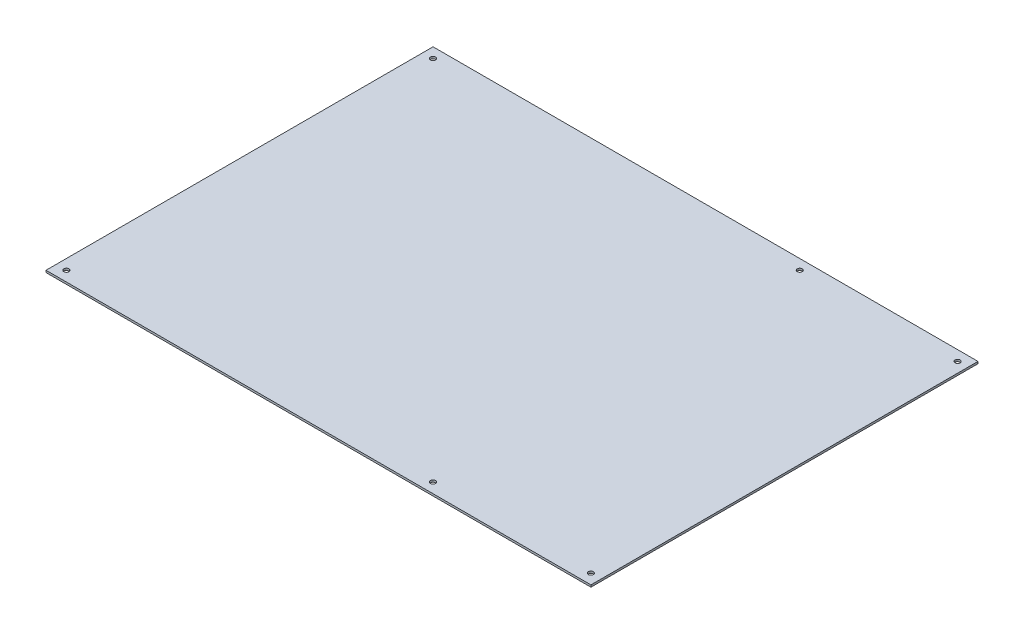
ISO-10303-21;
HEADER;
FILE_DESCRIPTION(('STEP AP214'),'2;1');
FILE_NAME('part.step','',(''),(''),'','','');
FILE_SCHEMA(('AUTOMOTIVE_DESIGN { 1 0 10303 214 1 1 1 1 }'));
ENDSEC;
DATA;
#1=APPLICATION_CONTEXT('core data for automotive mechanical design processes');
#2=APPLICATION_PROTOCOL_DEFINITION('international standard','automotive_design',2000,#1);
#3=PRODUCT_CONTEXT('',#1,'mechanical');
#4=PRODUCT('Part','Part','',(#3));
#5=PRODUCT_RELATED_PRODUCT_CATEGORY('part','',(#4));
#6=PRODUCT_DEFINITION_FORMATION('','',#4);
#7=PRODUCT_DEFINITION_CONTEXT('part definition',#1,'design');
#8=PRODUCT_DEFINITION('design','',#6,#7);
#9=PRODUCT_DEFINITION_SHAPE('','',#8);
#10=(LENGTH_UNIT() NAMED_UNIT(*) SI_UNIT(.MILLI.,.METRE.));
#11=(NAMED_UNIT(*) PLANE_ANGLE_UNIT() SI_UNIT($,.RADIAN.));
#12=(NAMED_UNIT(*) SI_UNIT($,.STERADIAN.) SOLID_ANGLE_UNIT());
#13=UNCERTAINTY_MEASURE_WITH_UNIT(LENGTH_MEASURE(1.E-05),#10,'distance_accuracy_value','');
#14=(GEOMETRIC_REPRESENTATION_CONTEXT(3) GLOBAL_UNCERTAINTY_ASSIGNED_CONTEXT((#13)) GLOBAL_UNIT_ASSIGNED_CONTEXT((#10,
#11,#12)) REPRESENTATION_CONTEXT('',''));
#15=CARTESIAN_POINT('',(0.,0.,0.));
#16=DIRECTION('',(0.,0.,1.));
#17=DIRECTION('',(1.,0.,0.));
#18=AXIS2_PLACEMENT_3D('',#15,#16,#17);
#19=CARTESIAN_POINT('',(0.,2.,0.));
#20=DIRECTION('',(0.,1.,0.));
#21=DIRECTION('',(0.,0.,1.));
#22=AXIS2_PLACEMENT_3D('',#19,#20,#21);
#23=PLANE('',#22);
#24=CARTESIAN_POINT('',(102.5,2.,-180.));
#25=DIRECTION('',(0.,1.,0.));
#26=DIRECTION('',(0.,0.,1.));
#27=AXIS2_PLACEMENT_3D('',#24,#25,#26);
#28=CIRCLE('',#27,2.5);
#29=CARTESIAN_POINT('',(102.5,2.,-177.5));
#30=VERTEX_POINT('',#29);
#31=EDGE_CURVE('E133',#30,#30,#28,.T.);
#32=ORIENTED_EDGE('',*,*,#31,.F.);
#33=EDGE_LOOP('',(#32));
#34=FACE_BOUND('',#33,.T.);
#35=CARTESIAN_POINT('',(102.5,2.,180.));
#36=DIRECTION('',(0.,1.,0.));
#37=DIRECTION('',(0.,0.,1.));
#38=AXIS2_PLACEMENT_3D('',#35,#36,#37);
#39=CIRCLE('',#38,2.5);
#40=CARTESIAN_POINT('',(102.5,2.,182.5));
#41=VERTEX_POINT('',#40);
#42=EDGE_CURVE('E121',#41,#41,#39,.T.);
#43=ORIENTED_EDGE('',*,*,#42,.F.);
#44=EDGE_LOOP('',(#43));
#45=FACE_BOUND('',#44,.T.);
#46=CARTESIAN_POINT('',(-257.529345710718,2.,-180.));
#47=DIRECTION('',(0.,1.,0.));
#48=DIRECTION('',(0.,0.,1.));
#49=AXIS2_PLACEMENT_3D('',#46,#47,#48);
#50=CIRCLE('',#49,2.50000000000002);
#51=CARTESIAN_POINT('',(-257.529345710718,2.,-177.5));
#52=VERTEX_POINT('',#51);
#53=EDGE_CURVE('E100',#52,#52,#50,.T.);
#54=ORIENTED_EDGE('',*,*,#53,.F.);
#55=EDGE_LOOP('',(#54));
#56=FACE_BOUND('',#55,.T.);
#57=DIRECTION('',(0.,0.,1.));
#58=VECTOR('',#57,1.);
#59=CARTESIAN_POINT('',(-267.5,2.,190.));
#60=LINE('',#59,#58);
#61=CARTESIAN_POINT('',(-267.5,2.,-190.));
#62=VERTEX_POINT('',#61);
#63=CARTESIAN_POINT('',(-267.5,2.,190.));
#64=VERTEX_POINT('',#63);
#65=EDGE_CURVE('E85',#62,#64,#60,.T.);
#66=ORIENTED_EDGE('',*,*,#65,.T.);
#67=DIRECTION('',(1.,0.,0.));
#68=VECTOR('',#67,1.);
#69=CARTESIAN_POINT('',(267.5,2.,190.));
#70=LINE('',#69,#68);
#71=CARTESIAN_POINT('',(267.5,2.,190.));
#72=VERTEX_POINT('',#71);
#73=EDGE_CURVE('E80',#64,#72,#70,.T.);
#74=ORIENTED_EDGE('',*,*,#73,.T.);
#75=DIRECTION('',(0.,0.,-1.));
#76=VECTOR('',#75,1.);
#77=CARTESIAN_POINT('',(267.5,2.,190.));
#78=LINE('',#77,#76);
#79=CARTESIAN_POINT('',(267.5,2.,-190.));
#80=VERTEX_POINT('',#79);
#81=EDGE_CURVE('E83',#72,#80,#78,.T.);
#82=ORIENTED_EDGE('',*,*,#81,.T.);
#83=DIRECTION('',(-1.,0.,0.));
#84=VECTOR('',#83,1.);
#85=CARTESIAN_POINT('',(267.5,2.,-190.));
#86=LINE('',#85,#84);
#87=EDGE_CURVE('E50',#80,#62,#86,.T.);
#88=ORIENTED_EDGE('',*,*,#87,.T.);
#89=EDGE_LOOP('',(#66,#74,#82,#88));
#90=FACE_BOUND('',#89,.T.);
#91=CARTESIAN_POINT('',(-257.5,2.,180.));
#92=DIRECTION('',(0.,1.,0.));
#93=DIRECTION('',(0.,0.,1.));
#94=AXIS2_PLACEMENT_3D('',#91,#92,#93);
#95=CIRCLE('',#94,2.50000000000002);
#96=CARTESIAN_POINT('',(-257.5,2.,182.5));
#97=VERTEX_POINT('',#96);
#98=EDGE_CURVE('E115',#97,#97,#95,.T.);
#99=ORIENTED_EDGE('',*,*,#98,.F.);
#100=EDGE_LOOP('',(#99));
#101=FACE_BOUND('',#100,.T.);
#102=CARTESIAN_POINT('',(257.5,2.,180.));
#103=DIRECTION('',(0.,1.,0.));
#104=DIRECTION('',(0.,0.,1.));
#105=AXIS2_PLACEMENT_3D('',#102,#103,#104);
#106=CIRCLE('',#105,2.50000000000002);
#107=CARTESIAN_POINT('',(257.5,2.,182.5));
#108=VERTEX_POINT('',#107);
#109=EDGE_CURVE('E127',#108,#108,#106,.T.);
#110=ORIENTED_EDGE('',*,*,#109,.F.);
#111=EDGE_LOOP('',(#110));
#112=FACE_BOUND('',#111,.T.);
#113=CARTESIAN_POINT('',(257.5,2.,-180.));
#114=DIRECTION('',(0.,1.,0.));
#115=DIRECTION('',(0.,0.,1.));
#116=AXIS2_PLACEMENT_3D('',#113,#114,#115);
#117=CIRCLE('',#116,2.50000000000002);
#118=CARTESIAN_POINT('',(257.5,2.,-177.5));
#119=VERTEX_POINT('',#118);
#120=EDGE_CURVE('E139',#119,#119,#117,.T.);
#121=ORIENTED_EDGE('',*,*,#120,.F.);
#122=EDGE_LOOP('',(#121));
#123=FACE_BOUND('',#122,.T.);
#124=ADVANCED_FACE('F33',(#34,#45,#56,#90,#101,#112,#123),#23,.T.);
#125=CARTESIAN_POINT('',(0.,0.,0.));
#126=DIRECTION('',(0.,1.,0.));
#127=DIRECTION('',(0.,0.,1.));
#128=AXIS2_PLACEMENT_3D('',#125,#126,#127);
#129=PLANE('',#128);
#130=DIRECTION('',(0.,0.,1.));
#131=VECTOR('',#130,1.);
#132=CARTESIAN_POINT('',(-267.5,0.,190.));
#133=LINE('',#132,#131);
#134=CARTESIAN_POINT('',(-267.5,0.,-190.));
#135=VERTEX_POINT('',#134);
#136=CARTESIAN_POINT('',(-267.5,0.,190.));
#137=VERTEX_POINT('',#136);
#138=EDGE_CURVE('E97',#135,#137,#133,.T.);
#139=ORIENTED_EDGE('',*,*,#138,.F.);
#140=DIRECTION('',(-1.,0.,0.));
#141=VECTOR('',#140,1.);
#142=CARTESIAN_POINT('',(267.5,0.,-190.));
#143=LINE('',#142,#141);
#144=CARTESIAN_POINT('',(267.5,0.,-190.));
#145=VERTEX_POINT('',#144);
#146=EDGE_CURVE('E73',#145,#135,#143,.T.);
#147=ORIENTED_EDGE('',*,*,#146,.F.);
#148=DIRECTION('',(0.,0.,-1.));
#149=VECTOR('',#148,1.);
#150=CARTESIAN_POINT('',(267.5,0.,190.));
#151=LINE('',#150,#149);
#152=CARTESIAN_POINT('',(267.5,0.,190.));
#153=VERTEX_POINT('',#152);
#154=EDGE_CURVE('E67',#153,#145,#151,.T.);
#155=ORIENTED_EDGE('',*,*,#154,.F.);
#156=DIRECTION('',(1.,0.,0.));
#157=VECTOR('',#156,1.);
#158=CARTESIAN_POINT('',(267.5,0.,190.));
#159=LINE('',#158,#157);
#160=EDGE_CURVE('E89',#137,#153,#159,.T.);
#161=ORIENTED_EDGE('',*,*,#160,.F.);
#162=EDGE_LOOP('',(#139,#147,#155,#161));
#163=FACE_BOUND('',#162,.T.);
#164=CARTESIAN_POINT('',(-257.529345710718,0.,-180.));
#165=DIRECTION('',(0.,1.,0.));
#166=DIRECTION('',(0.,0.,1.));
#167=AXIS2_PLACEMENT_3D('',#164,#165,#166);
#168=CIRCLE('',#167,2.50000000000002);
#169=CARTESIAN_POINT('',(-257.529345710718,0.,-177.5));
#170=VERTEX_POINT('',#169);
#171=EDGE_CURVE('E112',#170,#170,#168,.T.);
#172=ORIENTED_EDGE('',*,*,#171,.T.);
#173=EDGE_LOOP('',(#172));
#174=FACE_BOUND('',#173,.T.);
#175=CARTESIAN_POINT('',(-257.5,0.,180.));
#176=DIRECTION('',(0.,1.,0.));
#177=DIRECTION('',(0.,0.,1.));
#178=AXIS2_PLACEMENT_3D('',#175,#176,#177);
#179=CIRCLE('',#178,2.50000000000002);
#180=CARTESIAN_POINT('',(-257.5,0.,182.5));
#181=VERTEX_POINT('',#180);
#182=EDGE_CURVE('E118',#181,#181,#179,.T.);
#183=ORIENTED_EDGE('',*,*,#182,.T.);
#184=EDGE_LOOP('',(#183));
#185=FACE_BOUND('',#184,.T.);
#186=CARTESIAN_POINT('',(102.5,0.,180.));
#187=DIRECTION('',(0.,1.,0.));
#188=DIRECTION('',(0.,0.,1.));
#189=AXIS2_PLACEMENT_3D('',#186,#187,#188);
#190=CIRCLE('',#189,2.5);
#191=CARTESIAN_POINT('',(102.5,0.,182.5));
#192=VERTEX_POINT('',#191);
#193=EDGE_CURVE('E124',#192,#192,#190,.T.);
#194=ORIENTED_EDGE('',*,*,#193,.T.);
#195=EDGE_LOOP('',(#194));
#196=FACE_BOUND('',#195,.T.);
#197=CARTESIAN_POINT('',(257.5,0.,180.));
#198=DIRECTION('',(0.,1.,0.));
#199=DIRECTION('',(0.,0.,1.));
#200=AXIS2_PLACEMENT_3D('',#197,#198,#199);
#201=CIRCLE('',#200,2.50000000000002);
#202=CARTESIAN_POINT('',(257.5,0.,182.5));
#203=VERTEX_POINT('',#202);
#204=EDGE_CURVE('E130',#203,#203,#201,.T.);
#205=ORIENTED_EDGE('',*,*,#204,.T.);
#206=EDGE_LOOP('',(#205));
#207=FACE_BOUND('',#206,.T.);
#208=CARTESIAN_POINT('',(102.5,0.,-180.));
#209=DIRECTION('',(0.,1.,0.));
#210=DIRECTION('',(0.,0.,1.));
#211=AXIS2_PLACEMENT_3D('',#208,#209,#210);
#212=CIRCLE('',#211,2.5);
#213=CARTESIAN_POINT('',(102.5,0.,-177.5));
#214=VERTEX_POINT('',#213);
#215=EDGE_CURVE('E136',#214,#214,#212,.T.);
#216=ORIENTED_EDGE('',*,*,#215,.T.);
#217=EDGE_LOOP('',(#216));
#218=FACE_BOUND('',#217,.T.);
#219=CARTESIAN_POINT('',(257.5,0.,-180.));
#220=DIRECTION('',(0.,1.,0.));
#221=DIRECTION('',(0.,0.,1.));
#222=AXIS2_PLACEMENT_3D('',#219,#220,#221);
#223=CIRCLE('',#222,2.50000000000002);
#224=CARTESIAN_POINT('',(257.5,0.,-177.5));
#225=VERTEX_POINT('',#224);
#226=EDGE_CURVE('E142',#225,#225,#223,.T.);
#227=ORIENTED_EDGE('',*,*,#226,.T.);
#228=EDGE_LOOP('',(#227));
#229=FACE_BOUND('',#228,.T.);
#230=ADVANCED_FACE('F108',(#163,#174,#185,#196,#207,#218,#229),#129,.F.);
#231=CARTESIAN_POINT('',(-267.5,2.,190.));
#232=DIRECTION('',(1.,0.,0.));
#233=DIRECTION('',(0.,0.,-1.));
#234=AXIS2_PLACEMENT_3D('',#231,#232,#233);
#235=PLANE('',#234);
#236=ORIENTED_EDGE('',*,*,#138,.T.);
#237=DIRECTION('',(0.,-1.,0.));
#238=VECTOR('',#237,1.);
#239=CARTESIAN_POINT('',(-267.5,2.,190.));
#240=LINE('',#239,#238);
#241=EDGE_CURVE('E11',#64,#137,#240,.T.);
#242=ORIENTED_EDGE('',*,*,#241,.F.);
#243=ORIENTED_EDGE('',*,*,#65,.F.);
#244=DIRECTION('',(0.,-1.,0.));
#245=VECTOR('',#244,1.);
#246=CARTESIAN_POINT('',(-267.5,2.,-190.));
#247=LINE('',#246,#245);
#248=EDGE_CURVE('E93',#62,#135,#247,.T.);
#249=ORIENTED_EDGE('',*,*,#248,.T.);
#250=EDGE_LOOP('',(#236,#242,#243,#249));
#251=FACE_BOUND('',#250,.T.);
#252=ADVANCED_FACE('F35',(#251),#235,.F.);
#253=CARTESIAN_POINT('',(267.5,2.,190.));
#254=DIRECTION('',(0.,0.,-1.));
#255=DIRECTION('',(-1.,0.,0.));
#256=AXIS2_PLACEMENT_3D('',#253,#254,#255);
#257=PLANE('',#256);
#258=ORIENTED_EDGE('',*,*,#160,.T.);
#259=DIRECTION('',(0.,-1.,0.));
#260=VECTOR('',#259,1.);
#261=CARTESIAN_POINT('',(267.5,2.,190.));
#262=LINE('',#261,#260);
#263=EDGE_CURVE('E42',#72,#153,#262,.T.);
#264=ORIENTED_EDGE('',*,*,#263,.F.);
#265=ORIENTED_EDGE('',*,*,#73,.F.);
#266=ORIENTED_EDGE('',*,*,#241,.T.);
#267=EDGE_LOOP('',(#258,#264,#265,#266));
#268=FACE_BOUND('',#267,.T.);
#269=ADVANCED_FACE('F88',(#268),#257,.F.);
#270=CARTESIAN_POINT('',(267.5,2.,190.));
#271=DIRECTION('',(-1.,0.,0.));
#272=DIRECTION('',(0.,0.,1.));
#273=AXIS2_PLACEMENT_3D('',#270,#271,#272);
#274=PLANE('',#273);
#275=ORIENTED_EDGE('',*,*,#154,.T.);
#276=DIRECTION('',(0.,-1.,0.));
#277=VECTOR('',#276,1.);
#278=CARTESIAN_POINT('',(267.5,2.,-190.));
#279=LINE('',#278,#277);
#280=EDGE_CURVE('E90',#80,#145,#279,.T.);
#281=ORIENTED_EDGE('',*,*,#280,.F.);
#282=ORIENTED_EDGE('',*,*,#81,.F.);
#283=ORIENTED_EDGE('',*,*,#263,.T.);
#284=EDGE_LOOP('',(#275,#281,#282,#283));
#285=FACE_BOUND('',#284,.T.);
#286=ADVANCED_FACE('F91',(#285),#274,.F.);
#287=CARTESIAN_POINT('',(267.5,2.,-190.));
#288=DIRECTION('',(0.,0.,1.));
#289=DIRECTION('',(1.,0.,0.));
#290=AXIS2_PLACEMENT_3D('',#287,#288,#289);
#291=PLANE('',#290);
#292=ORIENTED_EDGE('',*,*,#146,.T.);
#293=ORIENTED_EDGE('',*,*,#248,.F.);
#294=ORIENTED_EDGE('',*,*,#87,.F.);
#295=ORIENTED_EDGE('',*,*,#280,.T.);
#296=EDGE_LOOP('',(#292,#293,#294,#295));
#297=FACE_BOUND('',#296,.T.);
#298=ADVANCED_FACE('F105',(#297),#291,.F.);
#299=CARTESIAN_POINT('',(-257.529345710718,2.,-180.));
#300=DIRECTION('',(0.,-1.,0.));
#301=DIRECTION('',(0.,0.,-1.));
#302=AXIS2_PLACEMENT_3D('',#299,#300,#301);
#303=CYLINDRICAL_SURFACE('',#302,2.50000000000002);
#304=ORIENTED_EDGE('',*,*,#53,.T.);
#305=EDGE_LOOP('',(#304));
#306=FACE_BOUND('',#305,.T.);
#307=ORIENTED_EDGE('',*,*,#171,.F.);
#308=EDGE_LOOP('',(#307));
#309=FACE_BOUND('',#308,.T.);
#310=ADVANCED_FACE('F161',(#306,#309),#303,.F.);
#311=CARTESIAN_POINT('',(-257.5,2.,180.));
#312=DIRECTION('',(0.,-1.,0.));
#313=DIRECTION('',(0.,0.,-1.));
#314=AXIS2_PLACEMENT_3D('',#311,#312,#313);
#315=CYLINDRICAL_SURFACE('',#314,2.50000000000002);
#316=ORIENTED_EDGE('',*,*,#98,.T.);
#317=EDGE_LOOP('',(#316));
#318=FACE_BOUND('',#317,.T.);
#319=ORIENTED_EDGE('',*,*,#182,.F.);
#320=EDGE_LOOP('',(#319));
#321=FACE_BOUND('',#320,.T.);
#322=ADVANCED_FACE('F207',(#318,#321),#315,.F.);
#323=CARTESIAN_POINT('',(102.5,2.,180.));
#324=DIRECTION('',(0.,-1.,0.));
#325=DIRECTION('',(0.,0.,-1.));
#326=AXIS2_PLACEMENT_3D('',#323,#324,#325);
#327=CYLINDRICAL_SURFACE('',#326,2.5);
#328=ORIENTED_EDGE('',*,*,#42,.T.);
#329=EDGE_LOOP('',(#328));
#330=FACE_BOUND('',#329,.T.);
#331=ORIENTED_EDGE('',*,*,#193,.F.);
#332=EDGE_LOOP('',(#331));
#333=FACE_BOUND('',#332,.T.);
#334=ADVANCED_FACE('F215',(#330,#333),#327,.F.);
#335=CARTESIAN_POINT('',(257.5,2.,180.));
#336=DIRECTION('',(0.,-1.,0.));
#337=DIRECTION('',(0.,0.,-1.));
#338=AXIS2_PLACEMENT_3D('',#335,#336,#337);
#339=CYLINDRICAL_SURFACE('',#338,2.50000000000002);
#340=ORIENTED_EDGE('',*,*,#109,.T.);
#341=EDGE_LOOP('',(#340));
#342=FACE_BOUND('',#341,.T.);
#343=ORIENTED_EDGE('',*,*,#204,.F.);
#344=EDGE_LOOP('',(#343));
#345=FACE_BOUND('',#344,.T.);
#346=ADVANCED_FACE('F223',(#342,#345),#339,.F.);
#347=CARTESIAN_POINT('',(102.5,2.,-180.));
#348=DIRECTION('',(0.,-1.,0.));
#349=DIRECTION('',(0.,0.,-1.));
#350=AXIS2_PLACEMENT_3D('',#347,#348,#349);
#351=CYLINDRICAL_SURFACE('',#350,2.5);
#352=ORIENTED_EDGE('',*,*,#31,.T.);
#353=EDGE_LOOP('',(#352));
#354=FACE_BOUND('',#353,.T.);
#355=ORIENTED_EDGE('',*,*,#215,.F.);
#356=EDGE_LOOP('',(#355));
#357=FACE_BOUND('',#356,.T.);
#358=ADVANCED_FACE('F232',(#354,#357),#351,.F.);
#359=CARTESIAN_POINT('',(257.5,2.,-180.));
#360=DIRECTION('',(0.,-1.,0.));
#361=DIRECTION('',(0.,0.,-1.));
#362=AXIS2_PLACEMENT_3D('',#359,#360,#361);
#363=CYLINDRICAL_SURFACE('',#362,2.50000000000002);
#364=ORIENTED_EDGE('',*,*,#120,.T.);
#365=EDGE_LOOP('',(#364));
#366=FACE_BOUND('',#365,.T.);
#367=ORIENTED_EDGE('',*,*,#226,.F.);
#368=EDGE_LOOP('',(#367));
#369=FACE_BOUND('',#368,.T.);
#370=ADVANCED_FACE('F148',(#366,#369),#363,.F.);
#371=CLOSED_SHELL('',(#124,#230,#252,#269,#286,#298,#310,#322,#334,#346,#358,#370));
#372=MANIFOLD_SOLID_BREP('B2',#371);
#373=ADVANCED_BREP_SHAPE_REPRESENTATION('',(#18,#372),#14);
#374=SHAPE_DEFINITION_REPRESENTATION(#9,#373);
ENDSEC;
END-ISO-10303-21;
